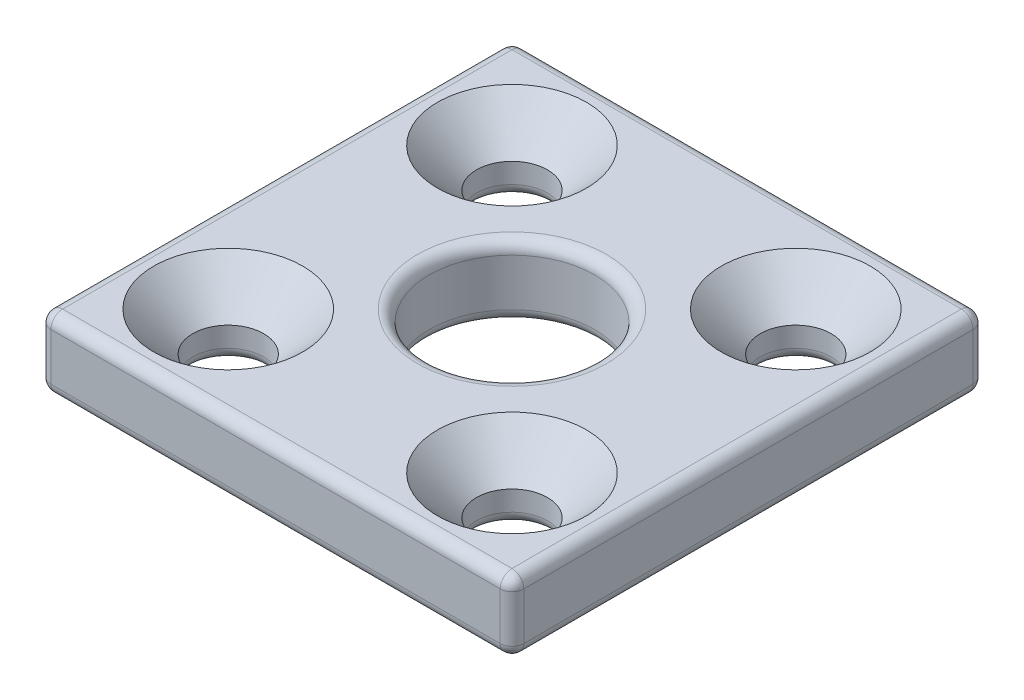
ISO-10303-21;
HEADER;
FILE_DESCRIPTION(('STEP AP214'),'2;1');
FILE_NAME('part.step','',(''),(''),'','','');
FILE_SCHEMA(('AUTOMOTIVE_DESIGN { 1 0 10303 214 1 1 1 1 }'));
ENDSEC;
DATA;
#1=APPLICATION_CONTEXT('core data for automotive mechanical design processes');
#2=APPLICATION_PROTOCOL_DEFINITION('international standard','automotive_design',2000,#1);
#3=PRODUCT_CONTEXT('',#1,'mechanical');
#4=PRODUCT('Part','Part','',(#3));
#5=PRODUCT_RELATED_PRODUCT_CATEGORY('part','',(#4));
#6=PRODUCT_DEFINITION_FORMATION('','',#4);
#7=PRODUCT_DEFINITION_CONTEXT('part definition',#1,'design');
#8=PRODUCT_DEFINITION('design','',#6,#7);
#9=PRODUCT_DEFINITION_SHAPE('','',#8);
#10=(LENGTH_UNIT() NAMED_UNIT(*) SI_UNIT(.MILLI.,.METRE.));
#11=(NAMED_UNIT(*) PLANE_ANGLE_UNIT() SI_UNIT($,.RADIAN.));
#12=(NAMED_UNIT(*) SI_UNIT($,.STERADIAN.) SOLID_ANGLE_UNIT());
#13=UNCERTAINTY_MEASURE_WITH_UNIT(LENGTH_MEASURE(1.E-05),#10,'distance_accuracy_value','');
#14=(GEOMETRIC_REPRESENTATION_CONTEXT(3) GLOBAL_UNCERTAINTY_ASSIGNED_CONTEXT((#13)) GLOBAL_UNIT_ASSIGNED_CONTEXT((#10,
#11,#12)) REPRESENTATION_CONTEXT('',''));
#15=CARTESIAN_POINT('',(0.,0.,0.));
#16=DIRECTION('',(0.,0.,1.));
#17=DIRECTION('',(1.,0.,0.));
#18=AXIS2_PLACEMENT_3D('',#15,#16,#17);
#19=CARTESIAN_POINT('',(0.,3.,0.));
#20=DIRECTION('',(0.,-1.,0.));
#21=DIRECTION('',(0.,0.,-1.));
#22=AXIS2_PLACEMENT_3D('',#19,#20,#21);
#23=PLANE('',#22);
#24=CARTESIAN_POINT('',(10.,3.,-10.));
#25=DIRECTION('',(0.,-1.,0.));
#26=DIRECTION('',(0.,0.,-1.));
#27=AXIS2_PLACEMENT_3D('',#24,#25,#26);
#28=CIRCLE('',#27,4.);
#29=CARTESIAN_POINT('',(10.,3.,-14.));
#30=VERTEX_POINT('',#29);
#31=EDGE_CURVE('E207',#30,#30,#28,.T.);
#32=ORIENTED_EDGE('',*,*,#31,.T.);
#33=EDGE_LOOP('',(#32));
#34=FACE_BOUND('',#33,.T.);
#35=DIRECTION('',(1.,0.,0.));
#36=VECTOR('',#35,1.);
#37=CARTESIAN_POINT('',(0.,3.,-0.5));
#38=LINE('',#37,#36);
#39=CARTESIAN_POINT('',(0.5,3.,-0.5));
#40=VERTEX_POINT('',#39);
#41=CARTESIAN_POINT('',(19.5,3.,-0.5));
#42=VERTEX_POINT('',#41);
#43=EDGE_CURVE('E198',#40,#42,#38,.T.);
#44=ORIENTED_EDGE('',*,*,#43,.T.);
#45=DIRECTION('',(0.,0.,-1.));
#46=VECTOR('',#45,1.);
#47=CARTESIAN_POINT('',(19.5,3.,0.));
#48=LINE('',#47,#46);
#49=CARTESIAN_POINT('',(19.5,3.,-19.5));
#50=VERTEX_POINT('',#49);
#51=EDGE_CURVE('E204',#42,#50,#48,.T.);
#52=ORIENTED_EDGE('',*,*,#51,.T.);
#53=DIRECTION('',(-1.,0.,0.));
#54=VECTOR('',#53,1.);
#55=CARTESIAN_POINT('',(0.,3.,-19.5));
#56=LINE('',#55,#54);
#57=CARTESIAN_POINT('',(0.5,3.,-19.5));
#58=VERTEX_POINT('',#57);
#59=EDGE_CURVE('E202',#50,#58,#56,.T.);
#60=ORIENTED_EDGE('',*,*,#59,.T.);
#61=DIRECTION('',(0.,0.,1.));
#62=VECTOR('',#61,1.);
#63=CARTESIAN_POINT('',(0.5,3.,0.));
#64=LINE('',#63,#62);
#65=EDGE_CURVE('E200',#58,#40,#64,.T.);
#66=ORIENTED_EDGE('',*,*,#65,.T.);
#67=EDGE_LOOP('',(#44,#52,#60,#66));
#68=FACE_BOUND('',#67,.T.);
#69=CARTESIAN_POINT('',(16.,3.,-4.));
#70=DIRECTION('',(0.,-1.,0.));
#71=DIRECTION('',(0.,0.,-1.));
#72=AXIS2_PLACEMENT_3D('',#69,#70,#71);
#73=CIRCLE('',#72,3.15000000000001);
#74=CARTESIAN_POINT('',(16.,3.,-7.15000000000001));
#75=VERTEX_POINT('',#74);
#76=EDGE_CURVE('E315',#75,#75,#73,.T.);
#77=ORIENTED_EDGE('',*,*,#76,.T.);
#78=EDGE_LOOP('',(#77));
#79=FACE_BOUND('',#78,.T.);
#80=CARTESIAN_POINT('',(4.,3.,-4.));
#81=DIRECTION('',(0.,-1.,0.));
#82=DIRECTION('',(0.,0.,-1.));
#83=AXIS2_PLACEMENT_3D('',#80,#81,#82);
#84=CIRCLE('',#83,3.15000000000001);
#85=CARTESIAN_POINT('',(4.,3.,-7.15000000000001));
#86=VERTEX_POINT('',#85);
#87=EDGE_CURVE('E312',#86,#86,#84,.T.);
#88=ORIENTED_EDGE('',*,*,#87,.T.);
#89=EDGE_LOOP('',(#88));
#90=FACE_BOUND('',#89,.T.);
#91=CARTESIAN_POINT('',(4.,3.,-16.));
#92=DIRECTION('',(0.,-1.,0.));
#93=DIRECTION('',(0.,0.,-1.));
#94=AXIS2_PLACEMENT_3D('',#91,#92,#93);
#95=CIRCLE('',#94,3.15000000000001);
#96=CARTESIAN_POINT('',(4.,3.,-19.15));
#97=VERTEX_POINT('',#96);
#98=EDGE_CURVE('E307',#97,#97,#95,.T.);
#99=ORIENTED_EDGE('',*,*,#98,.T.);
#100=EDGE_LOOP('',(#99));
#101=FACE_BOUND('',#100,.T.);
#102=CARTESIAN_POINT('',(16.,3.,-16.));
#103=DIRECTION('',(0.,-1.,0.));
#104=DIRECTION('',(0.,0.,-1.));
#105=AXIS2_PLACEMENT_3D('',#102,#103,#104);
#106=CIRCLE('',#105,3.15000000000001);
#107=CARTESIAN_POINT('',(16.,3.,-19.15));
#108=VERTEX_POINT('',#107);
#109=EDGE_CURVE('E302',#108,#108,#106,.T.);
#110=ORIENTED_EDGE('',*,*,#109,.T.);
#111=EDGE_LOOP('',(#110));
#112=FACE_BOUND('',#111,.T.);
#113=ADVANCED_FACE('F38',(#34,#68,#79,#90,#101,#112),#23,.F.);
#114=CARTESIAN_POINT('',(0.,0.,0.));
#115=DIRECTION('',(0.,-1.,0.));
#116=DIRECTION('',(0.,0.,-1.));
#117=AXIS2_PLACEMENT_3D('',#114,#115,#116);
#118=PLANE('',#117);
#119=CARTESIAN_POINT('',(16.,0.,-4.));
#120=DIRECTION('',(0.,-1.,0.));
#121=DIRECTION('',(0.,0.,-1.));
#122=AXIS2_PLACEMENT_3D('',#119,#120,#121);
#123=CIRCLE('',#122,2.);
#124=CARTESIAN_POINT('',(16.,0.,-6.));
#125=VERTEX_POINT('',#124);
#126=EDGE_CURVE('E177',#125,#125,#123,.F.);
#127=ORIENTED_EDGE('',*,*,#126,.T.);
#128=EDGE_LOOP('',(#127));
#129=FACE_BOUND('',#128,.T.);
#130=CARTESIAN_POINT('',(16.,0.,-16.));
#131=DIRECTION('',(0.,-1.,0.));
#132=DIRECTION('',(0.,0.,-1.));
#133=AXIS2_PLACEMENT_3D('',#130,#131,#132);
#134=CIRCLE('',#133,2.);
#135=CARTESIAN_POINT('',(16.,0.,-18.));
#136=VERTEX_POINT('',#135);
#137=EDGE_CURVE('E174',#136,#136,#134,.F.);
#138=ORIENTED_EDGE('',*,*,#137,.T.);
#139=EDGE_LOOP('',(#138));
#140=FACE_BOUND('',#139,.T.);
#141=CARTESIAN_POINT('',(4.,0.,-16.));
#142=DIRECTION('',(0.,-1.,0.));
#143=DIRECTION('',(0.,0.,-1.));
#144=AXIS2_PLACEMENT_3D('',#141,#142,#143);
#145=CIRCLE('',#144,2.);
#146=CARTESIAN_POINT('',(4.,0.,-18.));
#147=VERTEX_POINT('',#146);
#148=EDGE_CURVE('E171',#147,#147,#145,.F.);
#149=ORIENTED_EDGE('',*,*,#148,.T.);
#150=EDGE_LOOP('',(#149));
#151=FACE_BOUND('',#150,.T.);
#152=CARTESIAN_POINT('',(4.,0.,-4.));
#153=DIRECTION('',(0.,-1.,0.));
#154=DIRECTION('',(0.,0.,-1.));
#155=AXIS2_PLACEMENT_3D('',#152,#153,#154);
#156=CIRCLE('',#155,2.);
#157=CARTESIAN_POINT('',(4.,0.,-6.));
#158=VERTEX_POINT('',#157);
#159=EDGE_CURVE('E164',#158,#158,#156,.F.);
#160=ORIENTED_EDGE('',*,*,#159,.T.);
#161=EDGE_LOOP('',(#160));
#162=FACE_BOUND('',#161,.T.);
#163=CARTESIAN_POINT('',(10.,0.,-10.));
#164=DIRECTION('',(0.,-1.,0.));
#165=DIRECTION('',(0.,0.,-1.));
#166=AXIS2_PLACEMENT_3D('',#163,#164,#165);
#167=CIRCLE('',#166,4.);
#168=CARTESIAN_POINT('',(10.,0.,-14.));
#169=VERTEX_POINT('',#168);
#170=EDGE_CURVE('E161',#169,#169,#167,.F.);
#171=ORIENTED_EDGE('',*,*,#170,.T.);
#172=EDGE_LOOP('',(#171));
#173=FACE_BOUND('',#172,.T.);
#174=DIRECTION('',(-1.,0.,0.));
#175=VECTOR('',#174,1.);
#176=CARTESIAN_POINT('',(20.,0.,-19.5));
#177=LINE('',#176,#175);
#178=CARTESIAN_POINT('',(0.5,0.,-19.5));
#179=VERTEX_POINT('',#178);
#180=CARTESIAN_POINT('',(19.5,0.,-19.5));
#181=VERTEX_POINT('',#180);
#182=EDGE_CURVE('E160',#179,#181,#177,.F.);
#183=ORIENTED_EDGE('',*,*,#182,.T.);
#184=DIRECTION('',(0.,0.,-1.));
#185=VECTOR('',#184,1.);
#186=CARTESIAN_POINT('',(19.5,0.,0.));
#187=LINE('',#186,#185);
#188=CARTESIAN_POINT('',(19.5,0.,-0.5));
#189=VERTEX_POINT('',#188);
#190=EDGE_CURVE('E143',#181,#189,#187,.F.);
#191=ORIENTED_EDGE('',*,*,#190,.T.);
#192=DIRECTION('',(1.,0.,0.));
#193=VECTOR('',#192,1.);
#194=CARTESIAN_POINT('',(0.,0.,-0.5));
#195=LINE('',#194,#193);
#196=CARTESIAN_POINT('',(0.5,0.,-0.5));
#197=VERTEX_POINT('',#196);
#198=EDGE_CURVE('E149',#189,#197,#195,.F.);
#199=ORIENTED_EDGE('',*,*,#198,.T.);
#200=DIRECTION('',(0.,0.,1.));
#201=VECTOR('',#200,1.);
#202=CARTESIAN_POINT('',(0.5,0.,-20.));
#203=LINE('',#202,#201);
#204=EDGE_CURVE('E155',#197,#179,#203,.F.);
#205=ORIENTED_EDGE('',*,*,#204,.T.);
#206=EDGE_LOOP('',(#183,#191,#199,#205));
#207=FACE_BOUND('',#206,.T.);
#208=ADVANCED_FACE('F158',(#129,#140,#151,#162,#173,#207),#118,.T.);
#209=CARTESIAN_POINT('',(0.,3.,0.));
#210=DIRECTION('',(1.,0.,0.));
#211=DIRECTION('',(0.,0.,-1.));
#212=AXIS2_PLACEMENT_3D('',#209,#210,#211);
#213=PLANE('',#212);
#214=DIRECTION('',(0.,0.,1.));
#215=VECTOR('',#214,1.);
#216=CARTESIAN_POINT('',(0.,2.5,0.));
#217=LINE('',#216,#215);
#218=CARTESIAN_POINT('',(0.,2.5,-0.5));
#219=VERTEX_POINT('',#218);
#220=CARTESIAN_POINT('',(0.,2.5,-19.5));
#221=VERTEX_POINT('',#220);
#222=EDGE_CURVE('E231',#219,#221,#217,.F.);
#223=ORIENTED_EDGE('',*,*,#222,.T.);
#224=DIRECTION('',(0.,-1.,0.));
#225=VECTOR('',#224,1.);
#226=CARTESIAN_POINT('',(0.,3.,-19.5));
#227=LINE('',#226,#225);
#228=CARTESIAN_POINT('',(0.,0.5,-19.5));
#229=VERTEX_POINT('',#228);
#230=EDGE_CURVE('E233',#221,#229,#227,.T.);
#231=ORIENTED_EDGE('',*,*,#230,.T.);
#232=DIRECTION('',(0.,0.,1.));
#233=VECTOR('',#232,1.);
#234=CARTESIAN_POINT('',(0.,0.5,0.));
#235=LINE('',#234,#233);
#236=CARTESIAN_POINT('',(0.,0.5,-0.5));
#237=VERTEX_POINT('',#236);
#238=EDGE_CURVE('E229',#229,#237,#235,.T.);
#239=ORIENTED_EDGE('',*,*,#238,.T.);
#240=DIRECTION('',(0.,-1.,0.));
#241=VECTOR('',#240,1.);
#242=CARTESIAN_POINT('',(0.,3.,-0.5));
#243=LINE('',#242,#241);
#244=EDGE_CURVE('E227',#237,#219,#243,.F.);
#245=ORIENTED_EDGE('',*,*,#244,.T.);
#246=EDGE_LOOP('',(#223,#231,#239,#245));
#247=FACE_BOUND('',#246,.T.);
#248=ADVANCED_FACE('F377',(#247),#213,.F.);
#249=CARTESIAN_POINT('',(0.,3.,0.));
#250=DIRECTION('',(0.,0.,-1.));
#251=DIRECTION('',(-1.,0.,0.));
#252=AXIS2_PLACEMENT_3D('',#249,#250,#251);
#253=PLANE('',#252);
#254=DIRECTION('',(1.,0.,0.));
#255=VECTOR('',#254,1.);
#256=CARTESIAN_POINT('',(0.,2.5,0.));
#257=LINE('',#256,#255);
#258=CARTESIAN_POINT('',(19.5,2.5,0.));
#259=VERTEX_POINT('',#258);
#260=CARTESIAN_POINT('',(0.5,2.5,0.));
#261=VERTEX_POINT('',#260);
#262=EDGE_CURVE('E47',#259,#261,#257,.F.);
#263=ORIENTED_EDGE('',*,*,#262,.T.);
#264=DIRECTION('',(0.,-1.,0.));
#265=VECTOR('',#264,1.);
#266=CARTESIAN_POINT('',(0.5,3.,0.));
#267=LINE('',#266,#265);
#268=CARTESIAN_POINT('',(0.5,0.5,0.));
#269=VERTEX_POINT('',#268);
#270=EDGE_CURVE('E11',#261,#269,#267,.T.);
#271=ORIENTED_EDGE('',*,*,#270,.T.);
#272=DIRECTION('',(1.,0.,0.));
#273=VECTOR('',#272,1.);
#274=CARTESIAN_POINT('',(20.,0.5,0.));
#275=LINE('',#274,#273);
#276=CARTESIAN_POINT('',(19.5,0.5,0.));
#277=VERTEX_POINT('',#276);
#278=EDGE_CURVE('E236',#269,#277,#275,.T.);
#279=ORIENTED_EDGE('',*,*,#278,.T.);
#280=DIRECTION('',(0.,-1.,0.));
#281=VECTOR('',#280,1.);
#282=CARTESIAN_POINT('',(19.5,3.,0.));
#283=LINE('',#282,#281);
#284=EDGE_CURVE('E58',#277,#259,#283,.F.);
#285=ORIENTED_EDGE('',*,*,#284,.T.);
#286=EDGE_LOOP('',(#263,#271,#279,#285));
#287=FACE_BOUND('',#286,.T.);
#288=ADVANCED_FACE('F362',(#287),#253,.F.);
#289=CARTESIAN_POINT('',(20.,3.,0.));
#290=DIRECTION('',(-1.,0.,0.));
#291=DIRECTION('',(0.,0.,1.));
#292=AXIS2_PLACEMENT_3D('',#289,#290,#291);
#293=PLANE('',#292);
#294=DIRECTION('',(0.,0.,-1.));
#295=VECTOR('',#294,1.);
#296=CARTESIAN_POINT('',(20.,0.5,-20.));
#297=LINE('',#296,#295);
#298=CARTESIAN_POINT('',(20.,0.5,-0.5));
#299=VERTEX_POINT('',#298);
#300=CARTESIAN_POINT('',(20.,0.5,-19.5));
#301=VERTEX_POINT('',#300);
#302=EDGE_CURVE('E145',#299,#301,#297,.T.);
#303=ORIENTED_EDGE('',*,*,#302,.T.);
#304=DIRECTION('',(0.,-1.,0.));
#305=VECTOR('',#304,1.);
#306=CARTESIAN_POINT('',(20.,3.,-19.5));
#307=LINE('',#306,#305);
#308=CARTESIAN_POINT('',(20.,2.5,-19.5));
#309=VERTEX_POINT('',#308);
#310=EDGE_CURVE('E216',#301,#309,#307,.F.);
#311=ORIENTED_EDGE('',*,*,#310,.T.);
#312=DIRECTION('',(0.,0.,-1.));
#313=VECTOR('',#312,1.);
#314=CARTESIAN_POINT('',(20.,2.5,0.));
#315=LINE('',#314,#313);
#316=CARTESIAN_POINT('',(20.,2.5,-0.5));
#317=VERTEX_POINT('',#316);
#318=EDGE_CURVE('E213',#309,#317,#315,.F.);
#319=ORIENTED_EDGE('',*,*,#318,.T.);
#320=DIRECTION('',(0.,-1.,0.));
#321=VECTOR('',#320,1.);
#322=CARTESIAN_POINT('',(20.,3.,-0.5));
#323=LINE('',#322,#321);
#324=EDGE_CURVE('E210',#317,#299,#323,.T.);
#325=ORIENTED_EDGE('',*,*,#324,.T.);
#326=EDGE_LOOP('',(#303,#311,#319,#325));
#327=FACE_BOUND('',#326,.T.);
#328=ADVANCED_FACE('F341',(#327),#293,.F.);
#329=CARTESIAN_POINT('',(0.,3.,-20.));
#330=DIRECTION('',(0.,0.,1.));
#331=DIRECTION('',(1.,0.,0.));
#332=AXIS2_PLACEMENT_3D('',#329,#330,#331);
#333=PLANE('',#332);
#334=DIRECTION('',(-1.,0.,0.));
#335=VECTOR('',#334,1.);
#336=CARTESIAN_POINT('',(0.,2.5,-20.));
#337=LINE('',#336,#335);
#338=CARTESIAN_POINT('',(0.5,2.5,-20.));
#339=VERTEX_POINT('',#338);
#340=CARTESIAN_POINT('',(19.5,2.5,-20.));
#341=VERTEX_POINT('',#340);
#342=EDGE_CURVE('E222',#339,#341,#337,.F.);
#343=ORIENTED_EDGE('',*,*,#342,.T.);
#344=DIRECTION('',(0.,-1.,0.));
#345=VECTOR('',#344,1.);
#346=CARTESIAN_POINT('',(19.5,3.,-20.));
#347=LINE('',#346,#345);
#348=CARTESIAN_POINT('',(19.5,0.5,-20.));
#349=VERTEX_POINT('',#348);
#350=EDGE_CURVE('E224',#341,#349,#347,.T.);
#351=ORIENTED_EDGE('',*,*,#350,.T.);
#352=DIRECTION('',(-1.,0.,0.));
#353=VECTOR('',#352,1.);
#354=CARTESIAN_POINT('',(0.,0.5,-20.));
#355=LINE('',#354,#353);
#356=CARTESIAN_POINT('',(0.5,0.5,-20.));
#357=VERTEX_POINT('',#356);
#358=EDGE_CURVE('E220',#349,#357,#355,.T.);
#359=ORIENTED_EDGE('',*,*,#358,.T.);
#360=DIRECTION('',(0.,-1.,0.));
#361=VECTOR('',#360,1.);
#362=CARTESIAN_POINT('',(0.5,3.,-20.));
#363=LINE('',#362,#361);
#364=EDGE_CURVE('E218',#357,#339,#363,.F.);
#365=ORIENTED_EDGE('',*,*,#364,.T.);
#366=EDGE_LOOP('',(#343,#351,#359,#365));
#367=FACE_BOUND('',#366,.T.);
#368=ADVANCED_FACE('F385',(#367),#333,.F.);
#369=CARTESIAN_POINT('',(16.,3.,-16.));
#370=DIRECTION('',(0.,-1.,0.));
#371=DIRECTION('',(0.,0.,-1.));
#372=AXIS2_PLACEMENT_3D('',#369,#370,#371);
#373=CYLINDRICAL_SURFACE('',#372,1.5);
#374=CARTESIAN_POINT('',(16.,0.5,-16.));
#375=DIRECTION('',(0.,-1.,0.));
#376=DIRECTION('',(0.,0.,-1.));
#377=AXIS2_PLACEMENT_3D('',#374,#375,#376);
#378=CIRCLE('',#377,1.5);
#379=CARTESIAN_POINT('',(16.,0.5,-17.5));
#380=VERTEX_POINT('',#379);
#381=EDGE_CURVE('E183',#380,#380,#378,.T.);
#382=ORIENTED_EDGE('',*,*,#381,.T.);
#383=EDGE_LOOP('',(#382));
#384=FACE_BOUND('',#383,.T.);
#385=CARTESIAN_POINT('',(16.,1.35,-16.));
#386=DIRECTION('',(0.,-1.,0.));
#387=DIRECTION('',(0.,0.,-1.));
#388=AXIS2_PLACEMENT_3D('',#385,#386,#387);
#389=CIRCLE('',#388,1.5);
#390=CARTESIAN_POINT('',(16.,1.35,-17.5));
#391=VERTEX_POINT('',#390);
#392=EDGE_CURVE('E156',#391,#391,#389,.F.);
#393=ORIENTED_EDGE('',*,*,#392,.T.);
#394=EDGE_LOOP('',(#393));
#395=FACE_BOUND('',#394,.T.);
#396=ADVANCED_FACE('F382',(#384,#395),#373,.F.);
#397=CARTESIAN_POINT('',(4.,3.,-16.));
#398=DIRECTION('',(0.,-1.,0.));
#399=DIRECTION('',(0.,0.,-1.));
#400=AXIS2_PLACEMENT_3D('',#397,#398,#399);
#401=CYLINDRICAL_SURFACE('',#400,1.5);
#402=CARTESIAN_POINT('',(4.,0.5,-16.));
#403=DIRECTION('',(0.,-1.,0.));
#404=DIRECTION('',(0.,0.,-1.));
#405=AXIS2_PLACEMENT_3D('',#402,#403,#404);
#406=CIRCLE('',#405,1.5);
#407=CARTESIAN_POINT('',(4.,0.5,-17.5));
#408=VERTEX_POINT('',#407);
#409=EDGE_CURVE('E186',#408,#408,#406,.T.);
#410=ORIENTED_EDGE('',*,*,#409,.T.);
#411=EDGE_LOOP('',(#410));
#412=FACE_BOUND('',#411,.T.);
#413=CARTESIAN_POINT('',(4.,1.35,-16.));
#414=DIRECTION('',(0.,-1.,0.));
#415=DIRECTION('',(0.,0.,-1.));
#416=AXIS2_PLACEMENT_3D('',#413,#414,#415);
#417=CIRCLE('',#416,1.5);
#418=CARTESIAN_POINT('',(4.,1.35,-17.5));
#419=VERTEX_POINT('',#418);
#420=EDGE_CURVE('E321',#419,#419,#417,.F.);
#421=ORIENTED_EDGE('',*,*,#420,.T.);
#422=EDGE_LOOP('',(#421));
#423=FACE_BOUND('',#422,.T.);
#424=ADVANCED_FACE('F672',(#412,#423),#401,.F.);
#425=CARTESIAN_POINT('',(16.,3.,-4.));
#426=DIRECTION('',(0.,-1.,0.));
#427=DIRECTION('',(0.,0.,-1.));
#428=AXIS2_PLACEMENT_3D('',#425,#426,#427);
#429=CYLINDRICAL_SURFACE('',#428,1.5);
#430=CARTESIAN_POINT('',(16.,0.5,-4.));
#431=DIRECTION('',(0.,-1.,0.));
#432=DIRECTION('',(0.,0.,-1.));
#433=AXIS2_PLACEMENT_3D('',#430,#431,#432);
#434=CIRCLE('',#433,1.5);
#435=CARTESIAN_POINT('',(16.,0.5,-5.5));
#436=VERTEX_POINT('',#435);
#437=EDGE_CURVE('E180',#436,#436,#434,.T.);
#438=ORIENTED_EDGE('',*,*,#437,.T.);
#439=EDGE_LOOP('',(#438));
#440=FACE_BOUND('',#439,.T.);
#441=CARTESIAN_POINT('',(16.,1.35,-4.));
#442=DIRECTION('',(0.,-1.,0.));
#443=DIRECTION('',(0.,0.,-1.));
#444=AXIS2_PLACEMENT_3D('',#441,#442,#443);
#445=CIRCLE('',#444,1.5);
#446=CARTESIAN_POINT('',(16.,1.35,-5.5));
#447=VERTEX_POINT('',#446);
#448=EDGE_CURVE('E297',#447,#447,#445,.F.);
#449=ORIENTED_EDGE('',*,*,#448,.T.);
#450=EDGE_LOOP('',(#449));
#451=FACE_BOUND('',#450,.T.);
#452=ADVANCED_FACE('F663',(#440,#451),#429,.F.);
#453=CARTESIAN_POINT('',(4.,3.,-4.));
#454=DIRECTION('',(0.,-1.,0.));
#455=DIRECTION('',(0.,0.,-1.));
#456=AXIS2_PLACEMENT_3D('',#453,#454,#455);
#457=CYLINDRICAL_SURFACE('',#456,1.5);
#458=CARTESIAN_POINT('',(4.,0.5,-4.));
#459=DIRECTION('',(0.,-1.,0.));
#460=DIRECTION('',(0.,0.,-1.));
#461=AXIS2_PLACEMENT_3D('',#458,#459,#460);
#462=CIRCLE('',#461,1.5);
#463=CARTESIAN_POINT('',(4.,0.5,-5.5));
#464=VERTEX_POINT('',#463);
#465=EDGE_CURVE('E189',#464,#464,#462,.T.);
#466=ORIENTED_EDGE('',*,*,#465,.T.);
#467=EDGE_LOOP('',(#466));
#468=FACE_BOUND('',#467,.T.);
#469=CARTESIAN_POINT('',(4.,1.35,-4.));
#470=DIRECTION('',(0.,-1.,0.));
#471=DIRECTION('',(0.,0.,-1.));
#472=AXIS2_PLACEMENT_3D('',#469,#470,#471);
#473=CIRCLE('',#472,1.5);
#474=CARTESIAN_POINT('',(4.,1.35,-5.5));
#475=VERTEX_POINT('',#474);
#476=EDGE_CURVE('E318',#475,#475,#473,.F.);
#477=ORIENTED_EDGE('',*,*,#476,.T.);
#478=EDGE_LOOP('',(#477));
#479=FACE_BOUND('',#478,.T.);
#480=ADVANCED_FACE('F654',(#468,#479),#457,.F.);
#481=CARTESIAN_POINT('',(10.,3.,-10.));
#482=DIRECTION('',(0.,-1.,0.));
#483=DIRECTION('',(0.,0.,-1.));
#484=AXIS2_PLACEMENT_3D('',#481,#482,#483);
#485=CYLINDRICAL_SURFACE('',#484,3.5);
#486=CARTESIAN_POINT('',(10.,0.5,-10.));
#487=DIRECTION('',(0.,-1.,0.));
#488=DIRECTION('',(0.,0.,-1.));
#489=AXIS2_PLACEMENT_3D('',#486,#487,#488);
#490=CIRCLE('',#489,3.5);
#491=CARTESIAN_POINT('',(10.,0.5,-13.5));
#492=VERTEX_POINT('',#491);
#493=EDGE_CURVE('E195',#492,#492,#490,.T.);
#494=ORIENTED_EDGE('',*,*,#493,.T.);
#495=EDGE_LOOP('',(#494));
#496=FACE_BOUND('',#495,.T.);
#497=CARTESIAN_POINT('',(10.,2.5,-10.));
#498=DIRECTION('',(0.,-1.,0.));
#499=DIRECTION('',(0.,0.,-1.));
#500=AXIS2_PLACEMENT_3D('',#497,#498,#499);
#501=CIRCLE('',#500,3.5);
#502=CARTESIAN_POINT('',(10.,2.5,-13.5));
#503=VERTEX_POINT('',#502);
#504=EDGE_CURVE('E192',#503,#503,#501,.F.);
#505=ORIENTED_EDGE('',*,*,#504,.T.);
#506=EDGE_LOOP('',(#505));
#507=FACE_BOUND('',#506,.T.);
#508=ADVANCED_FACE('F400',(#496,#507),#485,.F.);
#509=CARTESIAN_POINT('',(16.,1.35,-4.));
#510=DIRECTION('',(0.,1.,0.));
#511=DIRECTION('',(0.,0.,1.));
#512=AXIS2_PLACEMENT_3D('',#509,#510,#511);
#513=CONICAL_SURFACE('',#512,1.5,0.78539816339745);
#514=ORIENTED_EDGE('',*,*,#76,.F.);
#515=EDGE_LOOP('',(#514));
#516=FACE_BOUND('',#515,.T.);
#517=ORIENTED_EDGE('',*,*,#448,.F.);
#518=EDGE_LOOP('',(#517));
#519=FACE_BOUND('',#518,.T.);
#520=ADVANCED_FACE('F396',(#516,#519),#513,.F.);
#521=CARTESIAN_POINT('',(4.,1.35,-4.));
#522=DIRECTION('',(0.,1.,0.));
#523=DIRECTION('',(0.,0.,1.));
#524=AXIS2_PLACEMENT_3D('',#521,#522,#523);
#525=CONICAL_SURFACE('',#524,1.5,0.78539816339745);
#526=ORIENTED_EDGE('',*,*,#87,.F.);
#527=EDGE_LOOP('',(#526));
#528=FACE_BOUND('',#527,.T.);
#529=ORIENTED_EDGE('',*,*,#476,.F.);
#530=EDGE_LOOP('',(#529));
#531=FACE_BOUND('',#530,.T.);
#532=ADVANCED_FACE('F399',(#528,#531),#525,.F.);
#533=CARTESIAN_POINT('',(4.,1.35,-16.));
#534=DIRECTION('',(0.,1.,0.));
#535=DIRECTION('',(0.,0.,1.));
#536=AXIS2_PLACEMENT_3D('',#533,#534,#535);
#537=CONICAL_SURFACE('',#536,1.5,0.78539816339745);
#538=ORIENTED_EDGE('',*,*,#98,.F.);
#539=EDGE_LOOP('',(#538));
#540=FACE_BOUND('',#539,.T.);
#541=ORIENTED_EDGE('',*,*,#420,.F.);
#542=EDGE_LOOP('',(#541));
#543=FACE_BOUND('',#542,.T.);
#544=ADVANCED_FACE('F404',(#540,#543),#537,.F.);
#545=CARTESIAN_POINT('',(16.,1.35,-16.));
#546=DIRECTION('',(0.,1.,0.));
#547=DIRECTION('',(0.,0.,1.));
#548=AXIS2_PLACEMENT_3D('',#545,#546,#547);
#549=CONICAL_SURFACE('',#548,1.5,0.78539816339745);
#550=ORIENTED_EDGE('',*,*,#109,.F.);
#551=EDGE_LOOP('',(#550));
#552=FACE_BOUND('',#551,.T.);
#553=ORIENTED_EDGE('',*,*,#392,.F.);
#554=EDGE_LOOP('',(#553));
#555=FACE_BOUND('',#554,.T.);
#556=ADVANCED_FACE('F408',(#552,#555),#549,.F.);
#557=CARTESIAN_POINT('',(16.,0.5,-4.));
#558=DIRECTION('',(0.,-1.,0.));
#559=DIRECTION('',(0.,0.,-1.));
#560=AXIS2_PLACEMENT_3D('',#557,#558,#559);
#561=TOROIDAL_SURFACE('',#560,2.,0.5);
#562=ORIENTED_EDGE('',*,*,#437,.F.);
#563=EDGE_LOOP('',(#562));
#564=FACE_BOUND('',#563,.T.);
#565=ORIENTED_EDGE('',*,*,#126,.F.);
#566=EDGE_LOOP('',(#565));
#567=FACE_BOUND('',#566,.T.);
#568=ADVANCED_FACE('F412',(#564,#567),#561,.T.);
#569=CARTESIAN_POINT('',(16.,0.5,-16.));
#570=DIRECTION('',(0.,-1.,0.));
#571=DIRECTION('',(0.,0.,-1.));
#572=AXIS2_PLACEMENT_3D('',#569,#570,#571);
#573=TOROIDAL_SURFACE('',#572,2.,0.5);
#574=ORIENTED_EDGE('',*,*,#381,.F.);
#575=EDGE_LOOP('',(#574));
#576=FACE_BOUND('',#575,.T.);
#577=ORIENTED_EDGE('',*,*,#137,.F.);
#578=EDGE_LOOP('',(#577));
#579=FACE_BOUND('',#578,.T.);
#580=ADVANCED_FACE('F416',(#576,#579),#573,.T.);
#581=CARTESIAN_POINT('',(4.,0.5,-16.));
#582=DIRECTION('',(0.,-1.,0.));
#583=DIRECTION('',(0.,0.,-1.));
#584=AXIS2_PLACEMENT_3D('',#581,#582,#583);
#585=TOROIDAL_SURFACE('',#584,2.,0.5);
#586=ORIENTED_EDGE('',*,*,#409,.F.);
#587=EDGE_LOOP('',(#586));
#588=FACE_BOUND('',#587,.T.);
#589=ORIENTED_EDGE('',*,*,#148,.F.);
#590=EDGE_LOOP('',(#589));
#591=FACE_BOUND('',#590,.T.);
#592=ADVANCED_FACE('F420',(#588,#591),#585,.T.);
#593=CARTESIAN_POINT('',(4.,0.5,-4.));
#594=DIRECTION('',(0.,-1.,0.));
#595=DIRECTION('',(0.,0.,-1.));
#596=AXIS2_PLACEMENT_3D('',#593,#594,#595);
#597=TOROIDAL_SURFACE('',#596,2.,0.5);
#598=ORIENTED_EDGE('',*,*,#465,.F.);
#599=EDGE_LOOP('',(#598));
#600=FACE_BOUND('',#599,.T.);
#601=ORIENTED_EDGE('',*,*,#159,.F.);
#602=EDGE_LOOP('',(#601));
#603=FACE_BOUND('',#602,.T.);
#604=ADVANCED_FACE('F424',(#600,#603),#597,.T.);
#605=CARTESIAN_POINT('',(10.,0.5,-10.));
#606=DIRECTION('',(0.,-1.,0.));
#607=DIRECTION('',(0.,0.,-1.));
#608=AXIS2_PLACEMENT_3D('',#605,#606,#607);
#609=TOROIDAL_SURFACE('',#608,4.,0.5);
#610=ORIENTED_EDGE('',*,*,#493,.F.);
#611=EDGE_LOOP('',(#610));
#612=FACE_BOUND('',#611,.T.);
#613=ORIENTED_EDGE('',*,*,#170,.F.);
#614=EDGE_LOOP('',(#613));
#615=FACE_BOUND('',#614,.T.);
#616=ADVANCED_FACE('F428',(#612,#615),#609,.T.);
#617=CARTESIAN_POINT('',(10.,2.5,-10.));
#618=DIRECTION('',(0.,-1.,0.));
#619=DIRECTION('',(0.,0.,-1.));
#620=AXIS2_PLACEMENT_3D('',#617,#618,#619);
#621=TOROIDAL_SURFACE('',#620,4.,0.5);
#622=ORIENTED_EDGE('',*,*,#31,.F.);
#623=EDGE_LOOP('',(#622));
#624=FACE_BOUND('',#623,.T.);
#625=ORIENTED_EDGE('',*,*,#504,.F.);
#626=EDGE_LOOP('',(#625));
#627=FACE_BOUND('',#626,.T.);
#628=ADVANCED_FACE('F370',(#624,#627),#621,.T.);
#629=CARTESIAN_POINT('',(0.5,0.5,0.));
#630=DIRECTION('',(0.,0.,-1.));
#631=DIRECTION('',(-1.,0.,0.));
#632=AXIS2_PLACEMENT_3D('',#629,#630,#631);
#633=CYLINDRICAL_SURFACE('',#632,0.5);
#634=CARTESIAN_POINT('',(0.5,0.5,-0.5));
#635=DIRECTION('',(0.,0.,1.));
#636=DIRECTION('',(1.,0.,0.));
#637=AXIS2_PLACEMENT_3D('',#634,#635,#636);
#638=CIRCLE('',#637,0.5);
#639=EDGE_CURVE('E42',#237,#197,#638,.T.);
#640=ORIENTED_EDGE('',*,*,#639,.F.);
#641=ORIENTED_EDGE('',*,*,#238,.F.);
#642=CARTESIAN_POINT('',(0.5,0.5,-19.5));
#643=DIRECTION('',(0.,0.,-1.));
#644=DIRECTION('',(-1.,0.,0.));
#645=AXIS2_PLACEMENT_3D('',#642,#643,#644);
#646=CIRCLE('',#645,0.5);
#647=EDGE_CURVE('E289',#179,#229,#646,.T.);
#648=ORIENTED_EDGE('',*,*,#647,.F.);
#649=ORIENTED_EDGE('',*,*,#204,.F.);
#650=EDGE_LOOP('',(#640,#641,#648,#649));
#651=FACE_BOUND('',#650,.T.);
#652=ADVANCED_FACE('F40',(#651),#633,.T.);
#653=CARTESIAN_POINT('',(0.5,0.5,-0.5));
#654=DIRECTION('',(0.,0.,1.));
#655=DIRECTION('',(1.,0.,0.));
#656=AXIS2_PLACEMENT_3D('',#653,#654,#655);
#657=SPHERICAL_SURFACE('',#656,0.5);
#658=CARTESIAN_POINT('',(0.5,0.5,-0.5));
#659=DIRECTION('',(0.,-1.,0.));
#660=DIRECTION('',(0.,0.,-1.));
#661=AXIS2_PLACEMENT_3D('',#658,#659,#660);
#662=CIRCLE('',#661,0.5);
#663=EDGE_CURVE('E286',#237,#269,#662,.F.);
#664=ORIENTED_EDGE('',*,*,#663,.F.);
#665=ORIENTED_EDGE('',*,*,#639,.T.);
#666=CARTESIAN_POINT('',(0.5,0.5,-0.5));
#667=DIRECTION('',(-1.,0.,0.));
#668=DIRECTION('',(0.,0.,1.));
#669=AXIS2_PLACEMENT_3D('',#666,#667,#668);
#670=CIRCLE('',#669,0.5);
#671=EDGE_CURVE('E152',#269,#197,#670,.F.);
#672=ORIENTED_EDGE('',*,*,#671,.F.);
#673=EDGE_LOOP('',(#664,#665,#672));
#674=FACE_BOUND('',#673,.T.);
#675=ADVANCED_FACE('F363',(#674),#657,.T.);
#676=CARTESIAN_POINT('',(0.5,0.5,-19.5));
#677=DIRECTION('',(0.,0.,1.));
#678=DIRECTION('',(1.,0.,0.));
#679=AXIS2_PLACEMENT_3D('',#676,#677,#678);
#680=SPHERICAL_SURFACE('',#679,0.5);
#681=CARTESIAN_POINT('',(0.5,0.5,-19.5));
#682=DIRECTION('',(-1.,0.,0.));
#683=DIRECTION('',(0.,0.,1.));
#684=AXIS2_PLACEMENT_3D('',#681,#682,#683);
#685=CIRCLE('',#684,0.5);
#686=EDGE_CURVE('E146',#179,#357,#685,.F.);
#687=ORIENTED_EDGE('',*,*,#686,.F.);
#688=ORIENTED_EDGE('',*,*,#647,.T.);
#689=CARTESIAN_POINT('',(0.5,0.5,-19.5));
#690=DIRECTION('',(0.,-1.,0.));
#691=DIRECTION('',(0.,0.,-1.));
#692=AXIS2_PLACEMENT_3D('',#689,#690,#691);
#693=CIRCLE('',#692,0.5);
#694=EDGE_CURVE('E284',#357,#229,#693,.F.);
#695=ORIENTED_EDGE('',*,*,#694,.F.);
#696=EDGE_LOOP('',(#687,#688,#695));
#697=FACE_BOUND('',#696,.T.);
#698=ADVANCED_FACE('F326',(#697),#680,.T.);
#699=CARTESIAN_POINT('',(0.,0.5,-0.5));
#700=DIRECTION('',(-1.,0.,0.));
#701=DIRECTION('',(0.,0.,1.));
#702=AXIS2_PLACEMENT_3D('',#699,#700,#701);
#703=CYLINDRICAL_SURFACE('',#702,0.5);
#704=ORIENTED_EDGE('',*,*,#671,.T.);
#705=ORIENTED_EDGE('',*,*,#198,.F.);
#706=CARTESIAN_POINT('',(19.5,0.5,-0.5));
#707=DIRECTION('',(1.,0.,0.));
#708=DIRECTION('',(0.,0.,-1.));
#709=AXIS2_PLACEMENT_3D('',#706,#707,#708);
#710=CIRCLE('',#709,0.5);
#711=EDGE_CURVE('E127',#277,#189,#710,.T.);
#712=ORIENTED_EDGE('',*,*,#711,.F.);
#713=ORIENTED_EDGE('',*,*,#278,.F.);
#714=EDGE_LOOP('',(#704,#705,#712,#713));
#715=FACE_BOUND('',#714,.T.);
#716=ADVANCED_FACE('F150',(#715),#703,.T.);
#717=CARTESIAN_POINT('',(0.5,3.,-0.5));
#718=DIRECTION('',(0.,-1.,0.));
#719=DIRECTION('',(0.,0.,-1.));
#720=AXIS2_PLACEMENT_3D('',#717,#718,#719);
#721=CYLINDRICAL_SURFACE('',#720,0.5);
#722=ORIENTED_EDGE('',*,*,#663,.T.);
#723=ORIENTED_EDGE('',*,*,#270,.F.);
#724=CARTESIAN_POINT('',(0.5,2.5,-0.5));
#725=DIRECTION('',(0.,1.,0.));
#726=DIRECTION('',(0.,0.,1.));
#727=AXIS2_PLACEMENT_3D('',#724,#725,#726);
#728=CIRCLE('',#727,0.5);
#729=EDGE_CURVE('E135',#219,#261,#728,.T.);
#730=ORIENTED_EDGE('',*,*,#729,.F.);
#731=ORIENTED_EDGE('',*,*,#244,.F.);
#732=EDGE_LOOP('',(#722,#723,#730,#731));
#733=FACE_BOUND('',#732,.T.);
#734=ADVANCED_FACE('F361',(#733),#721,.T.);
#735=CARTESIAN_POINT('',(0.5,2.5,0.));
#736=DIRECTION('',(0.,0.,1.));
#737=DIRECTION('',(1.,0.,0.));
#738=AXIS2_PLACEMENT_3D('',#735,#736,#737);
#739=CYLINDRICAL_SURFACE('',#738,0.5);
#740=CARTESIAN_POINT('',(0.5,2.5,-19.5));
#741=DIRECTION('',(0.,0.,-1.));
#742=DIRECTION('',(-1.,0.,0.));
#743=AXIS2_PLACEMENT_3D('',#740,#741,#742);
#744=CIRCLE('',#743,0.5);
#745=EDGE_CURVE('E274',#221,#58,#744,.T.);
#746=ORIENTED_EDGE('',*,*,#745,.F.);
#747=ORIENTED_EDGE('',*,*,#222,.F.);
#748=CARTESIAN_POINT('',(0.5,2.5,-0.5));
#749=DIRECTION('',(0.,0.,1.));
#750=DIRECTION('',(1.,0.,0.));
#751=AXIS2_PLACEMENT_3D('',#748,#749,#750);
#752=CIRCLE('',#751,0.5);
#753=EDGE_CURVE('E277',#40,#219,#752,.T.);
#754=ORIENTED_EDGE('',*,*,#753,.F.);
#755=ORIENTED_EDGE('',*,*,#65,.F.);
#756=EDGE_LOOP('',(#746,#747,#754,#755));
#757=FACE_BOUND('',#756,.T.);
#758=ADVANCED_FACE('F473',(#757),#739,.T.);
#759=CARTESIAN_POINT('',(0.5,3.,-19.5));
#760=DIRECTION('',(0.,-1.,0.));
#761=DIRECTION('',(0.,0.,-1.));
#762=AXIS2_PLACEMENT_3D('',#759,#760,#761);
#763=CYLINDRICAL_SURFACE('',#762,0.5);
#764=ORIENTED_EDGE('',*,*,#694,.T.);
#765=ORIENTED_EDGE('',*,*,#230,.F.);
#766=CARTESIAN_POINT('',(0.5,2.5,-19.5));
#767=DIRECTION('',(0.,1.,0.));
#768=DIRECTION('',(0.,0.,1.));
#769=AXIS2_PLACEMENT_3D('',#766,#767,#768);
#770=CIRCLE('',#769,0.5);
#771=EDGE_CURVE('E271',#339,#221,#770,.T.);
#772=ORIENTED_EDGE('',*,*,#771,.F.);
#773=ORIENTED_EDGE('',*,*,#364,.F.);
#774=EDGE_LOOP('',(#764,#765,#772,#773));
#775=FACE_BOUND('',#774,.T.);
#776=ADVANCED_FACE('F470',(#775),#763,.T.);
#777=CARTESIAN_POINT('',(0.,0.5,-19.5));
#778=DIRECTION('',(1.,0.,0.));
#779=DIRECTION('',(0.,0.,-1.));
#780=AXIS2_PLACEMENT_3D('',#777,#778,#779);
#781=CYLINDRICAL_SURFACE('',#780,0.5);
#782=ORIENTED_EDGE('',*,*,#686,.T.);
#783=ORIENTED_EDGE('',*,*,#358,.F.);
#784=CARTESIAN_POINT('',(19.5,0.5,-19.5));
#785=DIRECTION('',(1.,0.,0.));
#786=DIRECTION('',(0.,0.,-1.));
#787=AXIS2_PLACEMENT_3D('',#784,#785,#786);
#788=CIRCLE('',#787,0.5);
#789=EDGE_CURVE('E268',#181,#349,#788,.T.);
#790=ORIENTED_EDGE('',*,*,#789,.F.);
#791=ORIENTED_EDGE('',*,*,#182,.F.);
#792=EDGE_LOOP('',(#782,#783,#790,#791));
#793=FACE_BOUND('',#792,.T.);
#794=ADVANCED_FACE('F330',(#793),#781,.T.);
#795=CARTESIAN_POINT('',(19.5,0.5,0.));
#796=DIRECTION('',(0.,0.,1.));
#797=DIRECTION('',(1.,0.,0.));
#798=AXIS2_PLACEMENT_3D('',#795,#796,#797);
#799=CYLINDRICAL_SURFACE('',#798,0.5);
#800=CARTESIAN_POINT('',(19.5,0.5,-0.5));
#801=DIRECTION('',(0.,0.,1.));
#802=DIRECTION('',(1.,0.,0.));
#803=AXIS2_PLACEMENT_3D('',#800,#801,#802);
#804=CIRCLE('',#803,0.5);
#805=EDGE_CURVE('E130',#189,#299,#804,.T.);
#806=ORIENTED_EDGE('',*,*,#805,.F.);
#807=ORIENTED_EDGE('',*,*,#190,.F.);
#808=CARTESIAN_POINT('',(19.5,0.5,-19.5));
#809=DIRECTION('',(0.,0.,-1.));
#810=DIRECTION('',(-1.,0.,0.));
#811=AXIS2_PLACEMENT_3D('',#808,#809,#810);
#812=CIRCLE('',#811,0.5);
#813=EDGE_CURVE('E265',#301,#181,#812,.T.);
#814=ORIENTED_EDGE('',*,*,#813,.F.);
#815=ORIENTED_EDGE('',*,*,#302,.F.);
#816=EDGE_LOOP('',(#806,#807,#814,#815));
#817=FACE_BOUND('',#816,.T.);
#818=ADVANCED_FACE('F140',(#817),#799,.T.);
#819=CARTESIAN_POINT('',(19.5,0.5,-0.5));
#820=DIRECTION('',(0.,0.,1.));
#821=DIRECTION('',(1.,0.,0.));
#822=AXIS2_PLACEMENT_3D('',#819,#820,#821);
#823=SPHERICAL_SURFACE('',#822,0.5);
#824=ORIENTED_EDGE('',*,*,#711,.T.);
#825=ORIENTED_EDGE('',*,*,#805,.T.);
#826=CARTESIAN_POINT('',(19.5,0.5,-0.5));
#827=DIRECTION('',(0.,-1.,0.));
#828=DIRECTION('',(0.,0.,-1.));
#829=AXIS2_PLACEMENT_3D('',#826,#827,#828);
#830=CIRCLE('',#829,0.5);
#831=EDGE_CURVE('E132',#277,#299,#830,.F.);
#832=ORIENTED_EDGE('',*,*,#831,.F.);
#833=EDGE_LOOP('',(#824,#825,#832));
#834=FACE_BOUND('',#833,.T.);
#835=ADVANCED_FACE('F129',(#834),#823,.T.);
#836=CARTESIAN_POINT('',(0.5,2.5,-0.5));
#837=DIRECTION('',(0.,0.,1.));
#838=DIRECTION('',(1.,0.,0.));
#839=AXIS2_PLACEMENT_3D('',#836,#837,#838);
#840=SPHERICAL_SURFACE('',#839,0.5);
#841=ORIENTED_EDGE('',*,*,#753,.T.);
#842=ORIENTED_EDGE('',*,*,#729,.T.);
#843=CARTESIAN_POINT('',(0.5,2.5,-0.5));
#844=DIRECTION('',(-1.,0.,0.));
#845=DIRECTION('',(0.,0.,1.));
#846=AXIS2_PLACEMENT_3D('',#843,#844,#845);
#847=CIRCLE('',#846,0.5);
#848=EDGE_CURVE('E261',#40,#261,#847,.F.);
#849=ORIENTED_EDGE('',*,*,#848,.F.);
#850=EDGE_LOOP('',(#841,#842,#849));
#851=FACE_BOUND('',#850,.T.);
#852=ADVANCED_FACE('F356',(#851),#840,.T.);
#853=CARTESIAN_POINT('',(0.5,2.5,-19.5));
#854=DIRECTION('',(0.,0.,1.));
#855=DIRECTION('',(1.,0.,0.));
#856=AXIS2_PLACEMENT_3D('',#853,#854,#855);
#857=SPHERICAL_SURFACE('',#856,0.5);
#858=ORIENTED_EDGE('',*,*,#771,.T.);
#859=ORIENTED_EDGE('',*,*,#745,.T.);
#860=CARTESIAN_POINT('',(0.5,2.5,-19.5));
#861=DIRECTION('',(-1.,0.,0.));
#862=DIRECTION('',(0.,0.,1.));
#863=AXIS2_PLACEMENT_3D('',#860,#861,#862);
#864=CIRCLE('',#863,0.5);
#865=EDGE_CURVE('E258',#339,#58,#864,.F.);
#866=ORIENTED_EDGE('',*,*,#865,.F.);
#867=EDGE_LOOP('',(#858,#859,#866));
#868=FACE_BOUND('',#867,.T.);
#869=ADVANCED_FACE('F458',(#868),#857,.T.);
#870=CARTESIAN_POINT('',(19.5,0.5,-19.5));
#871=DIRECTION('',(0.,0.,1.));
#872=DIRECTION('',(1.,0.,0.));
#873=AXIS2_PLACEMENT_3D('',#870,#871,#872);
#874=SPHERICAL_SURFACE('',#873,0.5);
#875=ORIENTED_EDGE('',*,*,#813,.T.);
#876=ORIENTED_EDGE('',*,*,#789,.T.);
#877=CARTESIAN_POINT('',(19.5,0.5,-19.5));
#878=DIRECTION('',(0.,-1.,0.));
#879=DIRECTION('',(0.,0.,-1.));
#880=AXIS2_PLACEMENT_3D('',#877,#878,#879);
#881=CIRCLE('',#880,0.5);
#882=EDGE_CURVE('E256',#301,#349,#881,.F.);
#883=ORIENTED_EDGE('',*,*,#882,.F.);
#884=EDGE_LOOP('',(#875,#876,#883));
#885=FACE_BOUND('',#884,.T.);
#886=ADVANCED_FACE('F333',(#885),#874,.T.);
#887=CARTESIAN_POINT('',(19.5,3.,-0.5));
#888=DIRECTION('',(0.,-1.,0.));
#889=DIRECTION('',(0.,0.,-1.));
#890=AXIS2_PLACEMENT_3D('',#887,#888,#889);
#891=CYLINDRICAL_SURFACE('',#890,0.5);
#892=ORIENTED_EDGE('',*,*,#831,.T.);
#893=ORIENTED_EDGE('',*,*,#324,.F.);
#894=CARTESIAN_POINT('',(19.5,2.5,-0.5));
#895=DIRECTION('',(0.,1.,0.));
#896=DIRECTION('',(0.,0.,1.));
#897=AXIS2_PLACEMENT_3D('',#894,#895,#896);
#898=CIRCLE('',#897,0.5);
#899=EDGE_CURVE('E253',#259,#317,#898,.T.);
#900=ORIENTED_EDGE('',*,*,#899,.F.);
#901=ORIENTED_EDGE('',*,*,#284,.F.);
#902=EDGE_LOOP('',(#892,#893,#900,#901));
#903=FACE_BOUND('',#902,.T.);
#904=ADVANCED_FACE('F345',(#903),#891,.T.);
#905=CARTESIAN_POINT('',(0.,2.5,-0.5));
#906=DIRECTION('',(1.,0.,0.));
#907=DIRECTION('',(0.,0.,-1.));
#908=AXIS2_PLACEMENT_3D('',#905,#906,#907);
#909=CYLINDRICAL_SURFACE('',#908,0.5);
#910=ORIENTED_EDGE('',*,*,#848,.T.);
#911=ORIENTED_EDGE('',*,*,#262,.F.);
#912=CARTESIAN_POINT('',(19.5,2.5,-0.5));
#913=DIRECTION('',(1.,0.,0.));
#914=DIRECTION('',(0.,0.,-1.));
#915=AXIS2_PLACEMENT_3D('',#912,#913,#914);
#916=CIRCLE('',#915,0.5);
#917=EDGE_CURVE('E250',#42,#259,#916,.T.);
#918=ORIENTED_EDGE('',*,*,#917,.F.);
#919=ORIENTED_EDGE('',*,*,#43,.F.);
#920=EDGE_LOOP('',(#910,#911,#918,#919));
#921=FACE_BOUND('',#920,.T.);
#922=ADVANCED_FACE('F353',(#921),#909,.T.);
#923=CARTESIAN_POINT('',(0.,2.5,-19.5));
#924=DIRECTION('',(-1.,0.,0.));
#925=DIRECTION('',(0.,0.,1.));
#926=AXIS2_PLACEMENT_3D('',#923,#924,#925);
#927=CYLINDRICAL_SURFACE('',#926,0.5);
#928=ORIENTED_EDGE('',*,*,#865,.T.);
#929=ORIENTED_EDGE('',*,*,#59,.F.);
#930=CARTESIAN_POINT('',(19.5,2.5,-19.5));
#931=DIRECTION('',(1.,0.,0.));
#932=DIRECTION('',(0.,0.,-1.));
#933=AXIS2_PLACEMENT_3D('',#930,#931,#932);
#934=CIRCLE('',#933,0.5);
#935=EDGE_CURVE('E247',#341,#50,#934,.T.);
#936=ORIENTED_EDGE('',*,*,#935,.F.);
#937=ORIENTED_EDGE('',*,*,#342,.F.);
#938=EDGE_LOOP('',(#928,#929,#936,#937));
#939=FACE_BOUND('',#938,.T.);
#940=ADVANCED_FACE('F448',(#939),#927,.T.);
#941=CARTESIAN_POINT('',(19.5,3.,-19.5));
#942=DIRECTION('',(0.,-1.,0.));
#943=DIRECTION('',(0.,0.,-1.));
#944=AXIS2_PLACEMENT_3D('',#941,#942,#943);
#945=CYLINDRICAL_SURFACE('',#944,0.5);
#946=ORIENTED_EDGE('',*,*,#882,.T.);
#947=ORIENTED_EDGE('',*,*,#350,.F.);
#948=CARTESIAN_POINT('',(19.5,2.5,-19.5));
#949=DIRECTION('',(0.,1.,0.));
#950=DIRECTION('',(0.,0.,1.));
#951=AXIS2_PLACEMENT_3D('',#948,#949,#950);
#952=CIRCLE('',#951,0.5);
#953=EDGE_CURVE('E244',#309,#341,#952,.T.);
#954=ORIENTED_EDGE('',*,*,#953,.F.);
#955=ORIENTED_EDGE('',*,*,#310,.F.);
#956=EDGE_LOOP('',(#946,#947,#954,#955));
#957=FACE_BOUND('',#956,.T.);
#958=ADVANCED_FACE('F338',(#957),#945,.T.);
#959=CARTESIAN_POINT('',(19.5,2.5,-0.5));
#960=DIRECTION('',(0.,0.,1.));
#961=DIRECTION('',(1.,0.,0.));
#962=AXIS2_PLACEMENT_3D('',#959,#960,#961);
#963=SPHERICAL_SURFACE('',#962,0.5);
#964=ORIENTED_EDGE('',*,*,#917,.T.);
#965=ORIENTED_EDGE('',*,*,#899,.T.);
#966=CARTESIAN_POINT('',(19.5,2.5,-0.5));
#967=DIRECTION('',(0.,0.,1.));
#968=DIRECTION('',(1.,0.,0.));
#969=AXIS2_PLACEMENT_3D('',#966,#967,#968);
#970=CIRCLE('',#969,0.5);
#971=EDGE_CURVE('E242',#42,#317,#970,.F.);
#972=ORIENTED_EDGE('',*,*,#971,.F.);
#973=EDGE_LOOP('',(#964,#965,#972));
#974=FACE_BOUND('',#973,.T.);
#975=ADVANCED_FACE('F349',(#974),#963,.T.);
#976=CARTESIAN_POINT('',(19.5,2.5,-19.5));
#977=DIRECTION('',(0.,0.,1.));
#978=DIRECTION('',(1.,0.,0.));
#979=AXIS2_PLACEMENT_3D('',#976,#977,#978);
#980=SPHERICAL_SURFACE('',#979,0.5);
#981=ORIENTED_EDGE('',*,*,#953,.T.);
#982=ORIENTED_EDGE('',*,*,#935,.T.);
#983=CARTESIAN_POINT('',(19.5,2.5,-19.5));
#984=DIRECTION('',(0.,0.,-1.));
#985=DIRECTION('',(-1.,0.,0.));
#986=AXIS2_PLACEMENT_3D('',#983,#984,#985);
#987=CIRCLE('',#986,0.5);
#988=EDGE_CURVE('E240',#309,#50,#987,.F.);
#989=ORIENTED_EDGE('',*,*,#988,.F.);
#990=EDGE_LOOP('',(#981,#982,#989));
#991=FACE_BOUND('',#990,.T.);
#992=ADVANCED_FACE('F439',(#991),#980,.T.);
#993=CARTESIAN_POINT('',(19.5,2.5,0.));
#994=DIRECTION('',(0.,0.,-1.));
#995=DIRECTION('',(-1.,0.,0.));
#996=AXIS2_PLACEMENT_3D('',#993,#994,#995);
#997=CYLINDRICAL_SURFACE('',#996,0.5);
#998=ORIENTED_EDGE('',*,*,#971,.T.);
#999=ORIENTED_EDGE('',*,*,#318,.F.);
#1000=ORIENTED_EDGE('',*,*,#988,.T.);
#1001=ORIENTED_EDGE('',*,*,#51,.F.);
#1002=EDGE_LOOP('',(#998,#999,#1000,#1001));
#1003=FACE_BOUND('',#1002,.T.);
#1004=ADVANCED_FACE('F436',(#1003),#997,.T.);
#1005=CLOSED_SHELL('',(#113,#208,#248,#288,#328,#368,#396,#424,#452,#480,#508,#520,#532,#544,
#556,#568,#580,#592,#604,#616,#628,#652,#675,#698,#716,#734,#758,#776,#794,#818,#835,#852,#869,
#886,#904,#922,#940,#958,#975,#992,#1004));
#1006=MANIFOLD_SOLID_BREP('B2',#1005);
#1007=ADVANCED_BREP_SHAPE_REPRESENTATION('',(#18,#1006),#14);
#1008=SHAPE_DEFINITION_REPRESENTATION(#9,#1007);
ENDSEC;
END-ISO-10303-21;
